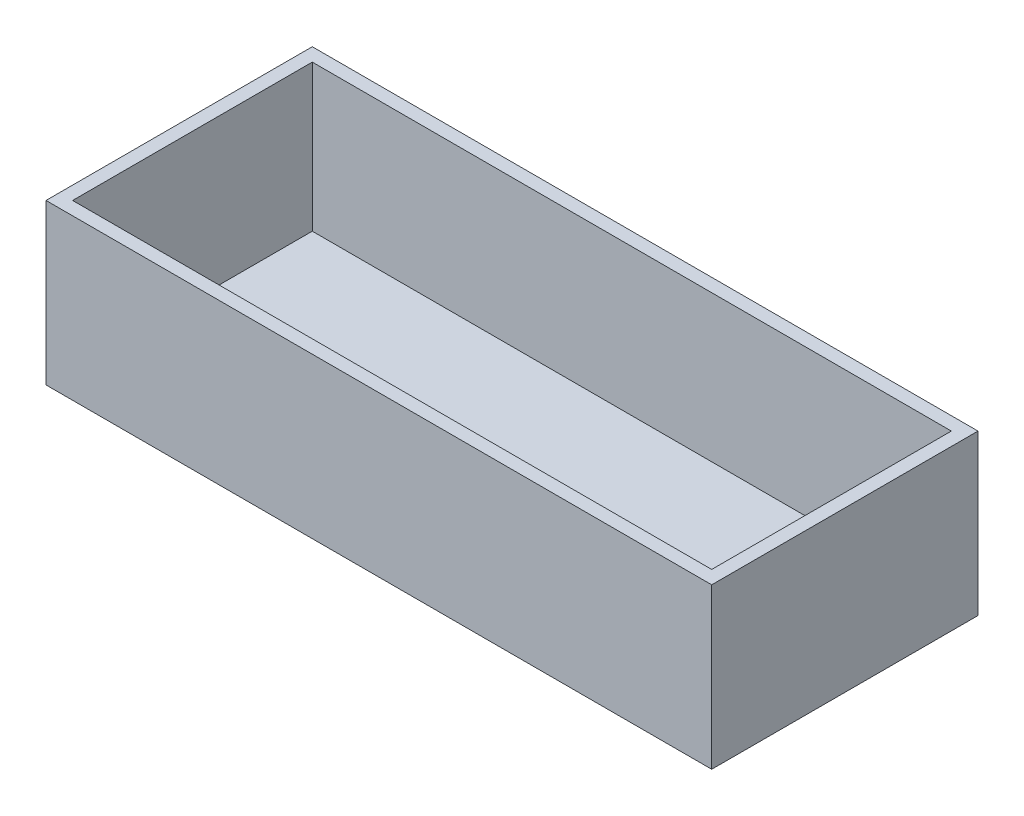
ISO-10303-21;
HEADER;
FILE_DESCRIPTION(('STEP AP214'),'2;1');
FILE_NAME('part.step','',(''),(''),'','','');
FILE_SCHEMA(('AUTOMOTIVE_DESIGN { 1 0 10303 214 1 1 1 1 }'));
ENDSEC;
DATA;
#1=APPLICATION_CONTEXT('core data for automotive mechanical design processes');
#2=APPLICATION_PROTOCOL_DEFINITION('international standard','automotive_design',2000,#1);
#3=PRODUCT_CONTEXT('',#1,'mechanical');
#4=PRODUCT('Part','Part','',(#3));
#5=PRODUCT_RELATED_PRODUCT_CATEGORY('part','',(#4));
#6=PRODUCT_DEFINITION_FORMATION('','',#4);
#7=PRODUCT_DEFINITION_CONTEXT('part definition',#1,'design');
#8=PRODUCT_DEFINITION('design','',#6,#7);
#9=PRODUCT_DEFINITION_SHAPE('','',#8);
#10=(LENGTH_UNIT() NAMED_UNIT(*) SI_UNIT(.MILLI.,.METRE.));
#11=(NAMED_UNIT(*) PLANE_ANGLE_UNIT() SI_UNIT($,.RADIAN.));
#12=(NAMED_UNIT(*) SI_UNIT($,.STERADIAN.) SOLID_ANGLE_UNIT());
#13=UNCERTAINTY_MEASURE_WITH_UNIT(LENGTH_MEASURE(1.E-05),#10,'distance_accuracy_value','');
#14=(GEOMETRIC_REPRESENTATION_CONTEXT(3) GLOBAL_UNCERTAINTY_ASSIGNED_CONTEXT((#13)) GLOBAL_UNIT_ASSIGNED_CONTEXT((#10,
#11,#12)) REPRESENTATION_CONTEXT('',''));
#15=CARTESIAN_POINT('',(0.,0.,0.));
#16=DIRECTION('',(0.,0.,1.));
#17=DIRECTION('',(1.,0.,0.));
#18=AXIS2_PLACEMENT_3D('',#15,#16,#17);
#19=CARTESIAN_POINT('',(-125.,30.,100.));
#20=DIRECTION('',(0.,-1.,0.));
#21=DIRECTION('',(0.,0.,-1.));
#22=AXIS2_PLACEMENT_3D('',#19,#20,#21);
#23=PLANE('',#22);
#24=DIRECTION('',(-1.,0.,0.));
#25=VECTOR('',#24,1.);
#26=CARTESIAN_POINT('',(-125.,30.,0.));
#27=LINE('',#26,#25);
#28=CARTESIAN_POINT('',(125.,30.,0.));
#29=VERTEX_POINT('',#28);
#30=CARTESIAN_POINT('',(-125.,30.,0.));
#31=VERTEX_POINT('',#30);
#32=EDGE_CURVE('E158',#29,#31,#27,.T.);
#33=ORIENTED_EDGE('',*,*,#32,.T.);
#34=DIRECTION('',(0.,0.,-1.));
#35=VECTOR('',#34,1.);
#36=CARTESIAN_POINT('',(-125.,30.,100.));
#37=LINE('',#36,#35);
#38=CARTESIAN_POINT('',(-125.,30.,100.));
#39=VERTEX_POINT('',#38);
#40=EDGE_CURVE('E43',#39,#31,#37,.T.);
#41=ORIENTED_EDGE('',*,*,#40,.F.);
#42=DIRECTION('',(-1.,0.,0.));
#43=VECTOR('',#42,1.);
#44=CARTESIAN_POINT('',(-125.,30.,100.));
#45=LINE('',#44,#43);
#46=CARTESIAN_POINT('',(125.,30.,100.));
#47=VERTEX_POINT('',#46);
#48=EDGE_CURVE('E87',#47,#39,#45,.T.);
#49=ORIENTED_EDGE('',*,*,#48,.F.);
#50=DIRECTION('',(0.,0.,-1.));
#51=VECTOR('',#50,1.);
#52=CARTESIAN_POINT('',(125.,30.,100.));
#53=LINE('',#52,#51);
#54=EDGE_CURVE('E11',#47,#29,#53,.T.);
#55=ORIENTED_EDGE('',*,*,#54,.T.);
#56=EDGE_LOOP('',(#33,#41,#49,#55));
#57=FACE_BOUND('',#56,.T.);
#58=DIRECTION('',(-1.,0.,0.));
#59=VECTOR('',#58,1.);
#60=CARTESIAN_POINT('',(0.,30.,5.));
#61=LINE('',#60,#59);
#62=CARTESIAN_POINT('',(120.,30.,5.));
#63=VERTEX_POINT('',#62);
#64=CARTESIAN_POINT('',(-120.,30.,5.));
#65=VERTEX_POINT('',#64);
#66=EDGE_CURVE('E131',#63,#65,#61,.T.);
#67=ORIENTED_EDGE('',*,*,#66,.F.);
#68=DIRECTION('',(0.,0.,-1.));
#69=VECTOR('',#68,1.);
#70=CARTESIAN_POINT('',(120.,30.,100.));
#71=LINE('',#70,#69);
#72=CARTESIAN_POINT('',(120.,30.,95.));
#73=VERTEX_POINT('',#72);
#74=EDGE_CURVE('E130',#73,#63,#71,.T.);
#75=ORIENTED_EDGE('',*,*,#74,.F.);
#76=DIRECTION('',(-1.,0.,0.));
#77=VECTOR('',#76,1.);
#78=CARTESIAN_POINT('',(0.,30.,95.));
#79=LINE('',#78,#77);
#80=CARTESIAN_POINT('',(-120.,30.,95.));
#81=VERTEX_POINT('',#80);
#82=EDGE_CURVE('E135',#73,#81,#79,.T.);
#83=ORIENTED_EDGE('',*,*,#82,.T.);
#84=DIRECTION('',(0.,0.,-1.));
#85=VECTOR('',#84,1.);
#86=CARTESIAN_POINT('',(-120.,30.,100.));
#87=LINE('',#86,#85);
#88=EDGE_CURVE('E140',#81,#65,#87,.T.);
#89=ORIENTED_EDGE('',*,*,#88,.T.);
#90=EDGE_LOOP('',(#67,#75,#83,#89));
#91=FACE_BOUND('',#90,.T.);
#92=ADVANCED_FACE('F35',(#57,#91),#23,.F.);
#93=CARTESIAN_POINT('',(125.,-30.,100.));
#94=DIRECTION('',(-1.,0.,0.));
#95=DIRECTION('',(0.,0.,1.));
#96=AXIS2_PLACEMENT_3D('',#93,#94,#95);
#97=PLANE('',#96);
#98=DIRECTION('',(0.,1.,0.));
#99=VECTOR('',#98,1.);
#100=CARTESIAN_POINT('',(125.,-30.,0.));
#101=LINE('',#100,#99);
#102=CARTESIAN_POINT('',(125.,-30.,0.));
#103=VERTEX_POINT('',#102);
#104=EDGE_CURVE('E143',#103,#29,#101,.T.);
#105=ORIENTED_EDGE('',*,*,#104,.T.);
#106=ORIENTED_EDGE('',*,*,#54,.F.);
#107=DIRECTION('',(0.,1.,0.));
#108=VECTOR('',#107,1.);
#109=CARTESIAN_POINT('',(125.,-30.,100.));
#110=LINE('',#109,#108);
#111=CARTESIAN_POINT('',(125.,-30.,100.));
#112=VERTEX_POINT('',#111);
#113=EDGE_CURVE('E149',#112,#47,#110,.T.);
#114=ORIENTED_EDGE('',*,*,#113,.F.);
#115=DIRECTION('',(0.,0.,-1.));
#116=VECTOR('',#115,1.);
#117=CARTESIAN_POINT('',(125.,-30.,100.));
#118=LINE('',#117,#116);
#119=EDGE_CURVE('E155',#112,#103,#118,.T.);
#120=ORIENTED_EDGE('',*,*,#119,.T.);
#121=EDGE_LOOP('',(#105,#106,#114,#120));
#122=FACE_BOUND('',#121,.T.);
#123=ADVANCED_FACE('F37',(#122),#97,.F.);
#124=CARTESIAN_POINT('',(-125.,-30.,100.));
#125=DIRECTION('',(1.,0.,0.));
#126=DIRECTION('',(0.,1.,0.));
#127=AXIS2_PLACEMENT_3D('',#124,#125,#126);
#128=PLANE('',#127);
#129=DIRECTION('',(0.,-1.,0.));
#130=VECTOR('',#129,1.);
#131=CARTESIAN_POINT('',(-125.,-30.,0.));
#132=LINE('',#131,#130);
#133=CARTESIAN_POINT('',(-125.,-30.,0.));
#134=VERTEX_POINT('',#133);
#135=EDGE_CURVE('E160',#31,#134,#132,.T.);
#136=ORIENTED_EDGE('',*,*,#135,.T.);
#137=DIRECTION('',(0.,0.,-1.));
#138=VECTOR('',#137,1.);
#139=CARTESIAN_POINT('',(-125.,-30.,100.));
#140=LINE('',#139,#138);
#141=CARTESIAN_POINT('',(-125.,-30.,100.));
#142=VERTEX_POINT('',#141);
#143=EDGE_CURVE('E164',#142,#134,#140,.T.);
#144=ORIENTED_EDGE('',*,*,#143,.F.);
#145=DIRECTION('',(0.,-1.,0.));
#146=VECTOR('',#145,1.);
#147=CARTESIAN_POINT('',(-125.,-30.,100.));
#148=LINE('',#147,#146);
#149=EDGE_CURVE('E152',#39,#142,#148,.T.);
#150=ORIENTED_EDGE('',*,*,#149,.F.);
#151=ORIENTED_EDGE('',*,*,#40,.T.);
#152=EDGE_LOOP('',(#136,#144,#150,#151));
#153=FACE_BOUND('',#152,.T.);
#154=ADVANCED_FACE('F169',(#153),#128,.F.);
#155=CARTESIAN_POINT('',(-125.,-30.,100.));
#156=DIRECTION('',(0.,1.,0.));
#157=DIRECTION('',(-1.,0.,0.));
#158=AXIS2_PLACEMENT_3D('',#155,#156,#157);
#159=PLANE('',#158);
#160=DIRECTION('',(1.,0.,0.));
#161=VECTOR('',#160,1.);
#162=CARTESIAN_POINT('',(-125.,-30.,0.));
#163=LINE('',#162,#161);
#164=EDGE_CURVE('E80',#134,#103,#163,.T.);
#165=ORIENTED_EDGE('',*,*,#164,.T.);
#166=ORIENTED_EDGE('',*,*,#119,.F.);
#167=DIRECTION('',(1.,0.,0.));
#168=VECTOR('',#167,1.);
#169=CARTESIAN_POINT('',(-125.,-30.,100.));
#170=LINE('',#169,#168);
#171=EDGE_CURVE('E59',#142,#112,#170,.T.);
#172=ORIENTED_EDGE('',*,*,#171,.F.);
#173=ORIENTED_EDGE('',*,*,#143,.T.);
#174=EDGE_LOOP('',(#165,#166,#172,#173));
#175=FACE_BOUND('',#174,.T.);
#176=ADVANCED_FACE('F177',(#175),#159,.F.);
#177=CARTESIAN_POINT('',(0.,0.,100.));
#178=DIRECTION('',(0.,0.,-1.));
#179=DIRECTION('',(-1.,0.,0.));
#180=AXIS2_PLACEMENT_3D('',#177,#178,#179);
#181=PLANE('',#180);
#182=ORIENTED_EDGE('',*,*,#113,.T.);
#183=ORIENTED_EDGE('',*,*,#48,.T.);
#184=ORIENTED_EDGE('',*,*,#149,.T.);
#185=ORIENTED_EDGE('',*,*,#171,.T.);
#186=EDGE_LOOP('',(#182,#183,#184,#185));
#187=FACE_BOUND('',#186,.T.);
#188=ADVANCED_FACE('F179',(#187),#181,.F.);
#189=CARTESIAN_POINT('',(0.,0.,0.));
#190=DIRECTION('',(0.,0.,-1.));
#191=DIRECTION('',(-1.,0.,0.));
#192=AXIS2_PLACEMENT_3D('',#189,#190,#191);
#193=PLANE('',#192);
#194=ORIENTED_EDGE('',*,*,#104,.F.);
#195=ORIENTED_EDGE('',*,*,#164,.F.);
#196=ORIENTED_EDGE('',*,*,#135,.F.);
#197=ORIENTED_EDGE('',*,*,#32,.F.);
#198=EDGE_LOOP('',(#194,#195,#196,#197));
#199=FACE_BOUND('',#198,.T.);
#200=ADVANCED_FACE('F173',(#199),#193,.T.);
#201=CARTESIAN_POINT('',(120.,-30.,100.));
#202=DIRECTION('',(-1.,0.,0.));
#203=DIRECTION('',(0.,0.,1.));
#204=AXIS2_PLACEMENT_3D('',#201,#202,#203);
#205=PLANE('',#204);
#206=DIRECTION('',(0.,1.,0.));
#207=VECTOR('',#206,1.);
#208=CARTESIAN_POINT('',(120.,0.,5.));
#209=LINE('',#208,#207);
#210=CARTESIAN_POINT('',(120.,-25.,5.));
#211=VERTEX_POINT('',#210);
#212=EDGE_CURVE('E114',#211,#63,#209,.T.);
#213=ORIENTED_EDGE('',*,*,#212,.F.);
#214=DIRECTION('',(0.,0.,-1.));
#215=VECTOR('',#214,1.);
#216=CARTESIAN_POINT('',(120.,-25.,100.));
#217=LINE('',#216,#215);
#218=CARTESIAN_POINT('',(120.,-25.,95.));
#219=VERTEX_POINT('',#218);
#220=EDGE_CURVE('E122',#219,#211,#217,.T.);
#221=ORIENTED_EDGE('',*,*,#220,.F.);
#222=DIRECTION('',(0.,1.,0.));
#223=VECTOR('',#222,1.);
#224=CARTESIAN_POINT('',(120.,0.,95.));
#225=LINE('',#224,#223);
#226=EDGE_CURVE('E50',#219,#73,#225,.T.);
#227=ORIENTED_EDGE('',*,*,#226,.T.);
#228=ORIENTED_EDGE('',*,*,#74,.T.);
#229=EDGE_LOOP('',(#213,#221,#227,#228));
#230=FACE_BOUND('',#229,.T.);
#231=ADVANCED_FACE('F128',(#230),#205,.T.);
#232=CARTESIAN_POINT('',(-120.,-30.,100.));
#233=DIRECTION('',(1.,0.,0.));
#234=DIRECTION('',(0.,1.,0.));
#235=AXIS2_PLACEMENT_3D('',#232,#233,#234);
#236=PLANE('',#235);
#237=DIRECTION('',(0.,-1.,0.));
#238=VECTOR('',#237,1.);
#239=CARTESIAN_POINT('',(-120.,0.,5.));
#240=LINE('',#239,#238);
#241=CARTESIAN_POINT('',(-120.,-25.,5.));
#242=VERTEX_POINT('',#241);
#243=EDGE_CURVE('E117',#65,#242,#240,.T.);
#244=ORIENTED_EDGE('',*,*,#243,.F.);
#245=ORIENTED_EDGE('',*,*,#88,.F.);
#246=DIRECTION('',(0.,-1.,0.));
#247=VECTOR('',#246,1.);
#248=CARTESIAN_POINT('',(-120.,0.,95.));
#249=LINE('',#248,#247);
#250=CARTESIAN_POINT('',(-120.,-25.,95.));
#251=VERTEX_POINT('',#250);
#252=EDGE_CURVE('E138',#81,#251,#249,.T.);
#253=ORIENTED_EDGE('',*,*,#252,.T.);
#254=DIRECTION('',(0.,0.,-1.));
#255=VECTOR('',#254,1.);
#256=CARTESIAN_POINT('',(-120.,-25.,100.));
#257=LINE('',#256,#255);
#258=EDGE_CURVE('E126',#251,#242,#257,.T.);
#259=ORIENTED_EDGE('',*,*,#258,.T.);
#260=EDGE_LOOP('',(#244,#245,#253,#259));
#261=FACE_BOUND('',#260,.T.);
#262=ADVANCED_FACE('F194',(#261),#236,.T.);
#263=CARTESIAN_POINT('',(-125.,-25.,100.));
#264=DIRECTION('',(0.,1.,0.));
#265=DIRECTION('',(-1.,0.,0.));
#266=AXIS2_PLACEMENT_3D('',#263,#264,#265);
#267=PLANE('',#266);
#268=DIRECTION('',(1.,0.,0.));
#269=VECTOR('',#268,1.);
#270=CARTESIAN_POINT('',(0.,-25.,5.));
#271=LINE('',#270,#269);
#272=EDGE_CURVE('E110',#242,#211,#271,.T.);
#273=ORIENTED_EDGE('',*,*,#272,.F.);
#274=ORIENTED_EDGE('',*,*,#258,.F.);
#275=DIRECTION('',(1.,0.,0.));
#276=VECTOR('',#275,1.);
#277=CARTESIAN_POINT('',(0.,-25.,95.));
#278=LINE('',#277,#276);
#279=EDGE_CURVE('E125',#251,#219,#278,.T.);
#280=ORIENTED_EDGE('',*,*,#279,.T.);
#281=ORIENTED_EDGE('',*,*,#220,.T.);
#282=EDGE_LOOP('',(#273,#274,#280,#281));
#283=FACE_BOUND('',#282,.T.);
#284=ADVANCED_FACE('F123',(#283),#267,.T.);
#285=CARTESIAN_POINT('',(0.,0.,95.));
#286=DIRECTION('',(0.,0.,-1.));
#287=DIRECTION('',(-1.,0.,0.));
#288=AXIS2_PLACEMENT_3D('',#285,#286,#287);
#289=PLANE('',#288);
#290=ORIENTED_EDGE('',*,*,#226,.F.);
#291=ORIENTED_EDGE('',*,*,#279,.F.);
#292=ORIENTED_EDGE('',*,*,#252,.F.);
#293=ORIENTED_EDGE('',*,*,#82,.F.);
#294=EDGE_LOOP('',(#290,#291,#292,#293));
#295=FACE_BOUND('',#294,.T.);
#296=ADVANCED_FACE('F197',(#295),#289,.T.);
#297=CARTESIAN_POINT('',(0.,0.,5.));
#298=DIRECTION('',(0.,0.,-1.));
#299=DIRECTION('',(-1.,0.,0.));
#300=AXIS2_PLACEMENT_3D('',#297,#298,#299);
#301=PLANE('',#300);
#302=ORIENTED_EDGE('',*,*,#212,.T.);
#303=ORIENTED_EDGE('',*,*,#66,.T.);
#304=ORIENTED_EDGE('',*,*,#243,.T.);
#305=ORIENTED_EDGE('',*,*,#272,.T.);
#306=EDGE_LOOP('',(#302,#303,#304,#305));
#307=FACE_BOUND('',#306,.T.);
#308=ADVANCED_FACE('F112',(#307),#301,.F.);
#309=CLOSED_SHELL('',(#92,#123,#154,#176,#188,#200,#231,#262,#284,#296,#308));
#310=MANIFOLD_SOLID_BREP('B2',#309);
#311=ADVANCED_BREP_SHAPE_REPRESENTATION('',(#18,#310),#14);
#312=SHAPE_DEFINITION_REPRESENTATION(#9,#311);
ENDSEC;
END-ISO-10303-21;
